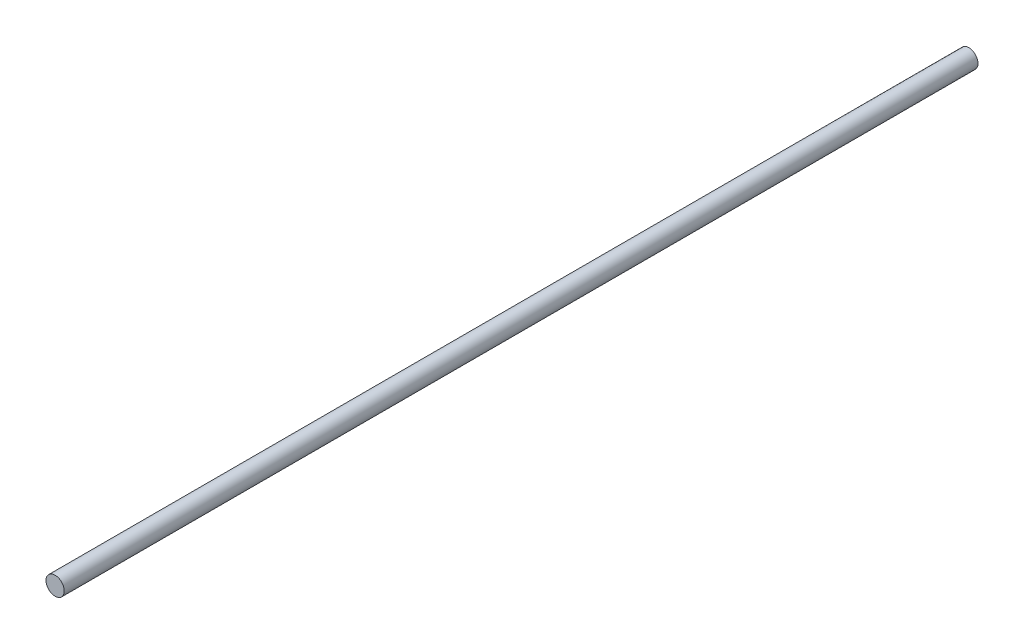
ISO-10303-21;
HEADER;
FILE_DESCRIPTION(('STEP AP214'),'2;1');
FILE_NAME('part.step','',(''),(''),'','','');
FILE_SCHEMA(('AUTOMOTIVE_DESIGN { 1 0 10303 214 1 1 1 1 }'));
ENDSEC;
DATA;
#1=APPLICATION_CONTEXT('core data for automotive mechanical design processes');
#2=APPLICATION_PROTOCOL_DEFINITION('international standard','automotive_design',2000,#1);
#3=PRODUCT_CONTEXT('',#1,'mechanical');
#4=PRODUCT('Part','Part','',(#3));
#5=PRODUCT_RELATED_PRODUCT_CATEGORY('part','',(#4));
#6=PRODUCT_DEFINITION_FORMATION('','',#4);
#7=PRODUCT_DEFINITION_CONTEXT('part definition',#1,'design');
#8=PRODUCT_DEFINITION('design','',#6,#7);
#9=PRODUCT_DEFINITION_SHAPE('','',#8);
#10=(LENGTH_UNIT() NAMED_UNIT(*) SI_UNIT(.MILLI.,.METRE.));
#11=(NAMED_UNIT(*) PLANE_ANGLE_UNIT() SI_UNIT($,.RADIAN.));
#12=(NAMED_UNIT(*) SI_UNIT($,.STERADIAN.) SOLID_ANGLE_UNIT());
#13=UNCERTAINTY_MEASURE_WITH_UNIT(LENGTH_MEASURE(1.E-05),#10,'distance_accuracy_value','');
#14=(GEOMETRIC_REPRESENTATION_CONTEXT(3) GLOBAL_UNCERTAINTY_ASSIGNED_CONTEXT((#13)) GLOBAL_UNIT_ASSIGNED_CONTEXT((#10,
#11,#12)) REPRESENTATION_CONTEXT('',''));
#15=CARTESIAN_POINT('',(0.,0.,0.));
#16=DIRECTION('',(0.,0.,1.));
#17=DIRECTION('',(1.,0.,0.));
#18=AXIS2_PLACEMENT_3D('',#15,#16,#17);
#19=CARTESIAN_POINT('',(0.,0.,50.));
#20=DIRECTION('',(0.,0.,-1.));
#21=DIRECTION('',(-1.,0.,0.));
#22=AXIS2_PLACEMENT_3D('',#19,#20,#21);
#23=CYLINDRICAL_SURFACE('',#22,0.5);
#24=CARTESIAN_POINT('',(0.,0.,50.));
#25=DIRECTION('',(0.,0.,1.));
#26=DIRECTION('',(1.,0.,0.));
#27=AXIS2_PLACEMENT_3D('',#24,#25,#26);
#28=CIRCLE('',#27,0.5);
#29=CARTESIAN_POINT('',(0.5,0.,50.));
#30=VERTEX_POINT('',#29);
#31=EDGE_CURVE('E10',#30,#30,#28,.T.);
#32=ORIENTED_EDGE('',*,*,#31,.F.);
#33=EDGE_LOOP('',(#32));
#34=FACE_BOUND('',#33,.T.);
#35=CARTESIAN_POINT('',(0.,0.,0.));
#36=DIRECTION('',(0.,0.,1.));
#37=DIRECTION('',(1.,0.,0.));
#38=AXIS2_PLACEMENT_3D('',#35,#36,#37);
#39=CIRCLE('',#38,0.5);
#40=CARTESIAN_POINT('',(0.5,0.,0.));
#41=VERTEX_POINT('',#40);
#42=EDGE_CURVE('E34',#41,#41,#39,.T.);
#43=ORIENTED_EDGE('',*,*,#42,.T.);
#44=EDGE_LOOP('',(#43));
#45=FACE_BOUND('',#44,.T.);
#46=ADVANCED_FACE('F31',(#34,#45),#23,.T.);
#47=CARTESIAN_POINT('',(0.,0.,50.));
#48=DIRECTION('',(0.,0.,1.));
#49=DIRECTION('',(1.,0.,0.));
#50=AXIS2_PLACEMENT_3D('',#47,#48,#49);
#51=PLANE('',#50);
#52=ORIENTED_EDGE('',*,*,#31,.T.);
#53=EDGE_LOOP('',(#52));
#54=FACE_BOUND('',#53,.T.);
#55=ADVANCED_FACE('F46',(#54),#51,.T.);
#56=CARTESIAN_POINT('',(0.,0.,0.));
#57=DIRECTION('',(0.,0.,1.));
#58=DIRECTION('',(1.,0.,0.));
#59=AXIS2_PLACEMENT_3D('',#56,#57,#58);
#60=PLANE('',#59);
#61=ORIENTED_EDGE('',*,*,#42,.F.);
#62=EDGE_LOOP('',(#61));
#63=FACE_BOUND('',#62,.T.);
#64=ADVANCED_FACE('F44',(#63),#60,.F.);
#65=CLOSED_SHELL('',(#46,#55,#64));
#66=MANIFOLD_SOLID_BREP('B2',#65);
#67=ADVANCED_BREP_SHAPE_REPRESENTATION('',(#18,#66),#14);
#68=SHAPE_DEFINITION_REPRESENTATION(#9,#67);
ENDSEC;
END-ISO-10303-21;
